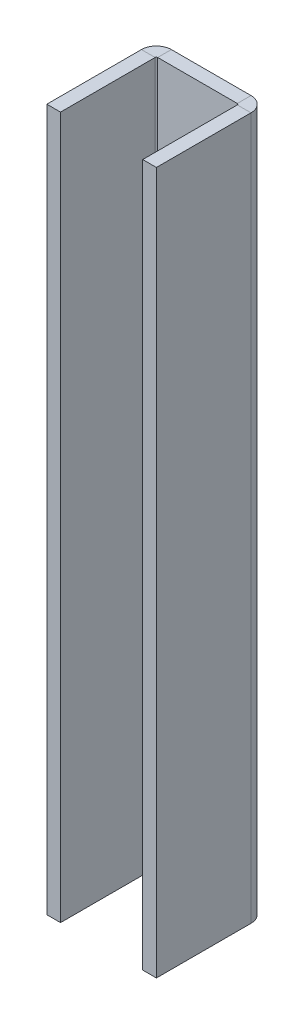
ISO-10303-21;
HEADER;
FILE_DESCRIPTION(('STEP AP214'),'2;1');
FILE_NAME('part.step','',(''),(''),'','','');
FILE_SCHEMA(('AUTOMOTIVE_DESIGN { 1 0 10303 214 1 1 1 1 }'));
ENDSEC;
DATA;
#1=APPLICATION_CONTEXT('core data for automotive mechanical design processes');
#2=APPLICATION_PROTOCOL_DEFINITION('international standard','automotive_design',2000,#1);
#3=PRODUCT_CONTEXT('',#1,'mechanical');
#4=PRODUCT('Part','Part','',(#3));
#5=PRODUCT_RELATED_PRODUCT_CATEGORY('part','',(#4));
#6=PRODUCT_DEFINITION_FORMATION('','',#4);
#7=PRODUCT_DEFINITION_CONTEXT('part definition',#1,'design');
#8=PRODUCT_DEFINITION('design','',#6,#7);
#9=PRODUCT_DEFINITION_SHAPE('','',#8);
#10=(LENGTH_UNIT() NAMED_UNIT(*) SI_UNIT(.MILLI.,.METRE.));
#11=(NAMED_UNIT(*) PLANE_ANGLE_UNIT() SI_UNIT($,.RADIAN.));
#12=(NAMED_UNIT(*) SI_UNIT($,.STERADIAN.) SOLID_ANGLE_UNIT());
#13=UNCERTAINTY_MEASURE_WITH_UNIT(LENGTH_MEASURE(1.E-05),#10,'distance_accuracy_value','');
#14=(GEOMETRIC_REPRESENTATION_CONTEXT(3) GLOBAL_UNCERTAINTY_ASSIGNED_CONTEXT((#13)) GLOBAL_UNIT_ASSIGNED_CONTEXT((#10,
#11,#12)) REPRESENTATION_CONTEXT('',''));
#15=CARTESIAN_POINT('',(0.,0.,0.));
#16=DIRECTION('',(0.,0.,1.));
#17=DIRECTION('',(1.,0.,0.));
#18=AXIS2_PLACEMENT_3D('',#15,#16,#17);
#19=CARTESIAN_POINT('',(0.,0.,-4.));
#20=DIRECTION('',(0.,0.,-1.));
#21=DIRECTION('',(-1.,0.,0.));
#22=AXIS2_PLACEMENT_3D('',#19,#20,#21);
#23=PLANE('',#22);
#24=DIRECTION('',(-1.,0.,0.));
#25=VECTOR('',#24,1.);
#26=CARTESIAN_POINT('',(8.,410.,-4.));
#27=LINE('',#26,#25);
#28=CARTESIAN_POINT('',(63.2634,410.,-4.));
#29=VERTEX_POINT('',#28);
#30=CARTESIAN_POINT('',(16.7366,410.,-4.));
#31=VERTEX_POINT('',#30);
#32=EDGE_CURVE('E13',#29,#31,#27,.T.);
#33=ORIENTED_EDGE('',*,*,#32,.F.);
#34=DIRECTION('',(0.,1.,0.));
#35=VECTOR('',#34,1.);
#36=CARTESIAN_POINT('',(63.2634,410.,-4.));
#37=LINE('',#36,#35);
#38=CARTESIAN_POINT('',(63.2634,2.77908306346521E-13,-4.));
#39=VERTEX_POINT('',#38);
#40=EDGE_CURVE('E178',#29,#39,#37,.F.);
#41=ORIENTED_EDGE('',*,*,#40,.T.);
#42=DIRECTION('',(1.,0.,0.));
#43=VECTOR('',#42,1.);
#44=CARTESIAN_POINT('',(8.,0.,-4.));
#45=LINE('',#44,#43);
#46=CARTESIAN_POINT('',(16.7366,0.,-4.));
#47=VERTEX_POINT('',#46);
#48=EDGE_CURVE('E92',#47,#39,#45,.T.);
#49=ORIENTED_EDGE('',*,*,#48,.F.);
#50=DIRECTION('',(0.,-1.,0.));
#51=VECTOR('',#50,1.);
#52=CARTESIAN_POINT('',(16.7366,0.,-4.));
#53=LINE('',#52,#51);
#54=EDGE_CURVE('E264',#47,#31,#53,.F.);
#55=ORIENTED_EDGE('',*,*,#54,.T.);
#56=EDGE_LOOP('',(#33,#41,#49,#55));
#57=FACE_BOUND('',#56,.T.);
#58=ADVANCED_FACE('F83',(#57),#23,.T.);
#59=CARTESIAN_POINT('',(0.,0.,4.));
#60=DIRECTION('',(0.,0.,-1.));
#61=DIRECTION('',(-1.,0.,0.));
#62=AXIS2_PLACEMENT_3D('',#59,#60,#61);
#63=PLANE('',#62);
#64=DIRECTION('',(0.,1.,0.));
#65=VECTOR('',#64,1.);
#66=CARTESIAN_POINT('',(63.2634,410.,4.));
#67=LINE('',#66,#65);
#68=CARTESIAN_POINT('',(63.2634,410.,4.));
#69=VERTEX_POINT('',#68);
#70=CARTESIAN_POINT('',(63.2634,2.22044604925031E-13,4.));
#71=VERTEX_POINT('',#70);
#72=EDGE_CURVE('E227',#69,#71,#67,.F.);
#73=ORIENTED_EDGE('',*,*,#72,.F.);
#74=DIRECTION('',(-1.,0.,0.));
#75=VECTOR('',#74,1.);
#76=CARTESIAN_POINT('',(8.,410.,4.));
#77=LINE('',#76,#75);
#78=CARTESIAN_POINT('',(16.7366,410.,4.));
#79=VERTEX_POINT('',#78);
#80=EDGE_CURVE('E87',#69,#79,#77,.T.);
#81=ORIENTED_EDGE('',*,*,#80,.T.);
#82=DIRECTION('',(0.,-1.,0.));
#83=VECTOR('',#82,1.);
#84=CARTESIAN_POINT('',(16.7366,0.,4.));
#85=LINE('',#84,#83);
#86=CARTESIAN_POINT('',(16.7366,0.,4.));
#87=VERTEX_POINT('',#86);
#88=EDGE_CURVE('E275',#87,#79,#85,.F.);
#89=ORIENTED_EDGE('',*,*,#88,.F.);
#90=DIRECTION('',(1.,0.,0.));
#91=VECTOR('',#90,1.);
#92=CARTESIAN_POINT('',(8.,0.,4.));
#93=LINE('',#92,#91);
#94=EDGE_CURVE('E281',#87,#71,#93,.T.);
#95=ORIENTED_EDGE('',*,*,#94,.T.);
#96=EDGE_LOOP('',(#73,#81,#89,#95));
#97=FACE_BOUND('',#96,.T.);
#98=ADVANCED_FACE('F293',(#97),#63,.F.);
#99=CARTESIAN_POINT('',(8.,410.,-4.));
#100=DIRECTION('',(0.,1.,0.));
#101=DIRECTION('',(0.,0.,1.));
#102=AXIS2_PLACEMENT_3D('',#99,#100,#101);
#103=PLANE('',#102);
#104=ORIENTED_EDGE('',*,*,#80,.F.);
#105=DIRECTION('',(0.,0.,-1.));
#106=VECTOR('',#105,1.);
#107=CARTESIAN_POINT('',(63.2634,410.,4.));
#108=LINE('',#107,#106);
#109=EDGE_CURVE('E223',#69,#29,#108,.T.);
#110=ORIENTED_EDGE('',*,*,#109,.T.);
#111=ORIENTED_EDGE('',*,*,#32,.T.);
#112=DIRECTION('',(0.,0.,-1.));
#113=VECTOR('',#112,1.);
#114=CARTESIAN_POINT('',(16.7366,410.,4.));
#115=LINE('',#114,#113);
#116=EDGE_CURVE('E279',#79,#31,#115,.T.);
#117=ORIENTED_EDGE('',*,*,#116,.F.);
#118=EDGE_LOOP('',(#104,#110,#111,#117));
#119=FACE_BOUND('',#118,.T.);
#120=ADVANCED_FACE('F295',(#119),#103,.T.);
#121=CARTESIAN_POINT('',(8.,0.,-4.));
#122=DIRECTION('',(0.,-1.,0.));
#123=DIRECTION('',(1.,0.,0.));
#124=AXIS2_PLACEMENT_3D('',#121,#122,#123);
#125=PLANE('',#124);
#126=DIRECTION('',(0.,0.,-1.));
#127=VECTOR('',#126,1.);
#128=CARTESIAN_POINT('',(63.2634,2.22044604925031E-13,4.));
#129=LINE('',#128,#127);
#130=EDGE_CURVE('E230',#71,#39,#129,.T.);
#131=ORIENTED_EDGE('',*,*,#130,.F.);
#132=ORIENTED_EDGE('',*,*,#94,.F.);
#133=DIRECTION('',(0.,0.,-1.));
#134=VECTOR('',#133,1.);
#135=CARTESIAN_POINT('',(16.7366,0.,4.));
#136=LINE('',#135,#134);
#137=EDGE_CURVE('E269',#87,#47,#136,.T.);
#138=ORIENTED_EDGE('',*,*,#137,.T.);
#139=ORIENTED_EDGE('',*,*,#48,.T.);
#140=EDGE_LOOP('',(#131,#132,#138,#139));
#141=FACE_BOUND('',#140,.T.);
#142=ADVANCED_FACE('F85',(#141),#125,.T.);
#143=CARTESIAN_POINT('',(16.7366,410.,4.7366));
#144=DIRECTION('',(0.,1.,0.));
#145=DIRECTION('',(0.,0.,1.));
#146=AXIS2_PLACEMENT_3D('',#143,#144,#145);
#147=PLANE('',#146);
#148=DIRECTION('',(1.,0.,0.));
#149=VECTOR('',#148,1.);
#150=CARTESIAN_POINT('',(8.,410.,4.73659999999997));
#151=LINE('',#150,#149);
#152=CARTESIAN_POINT('',(16.,410.,4.7366));
#153=VERTEX_POINT('',#152);
#154=CARTESIAN_POINT('',(8.,410.,4.73659999999997));
#155=VERTEX_POINT('',#154);
#156=EDGE_CURVE('E232',#153,#155,#151,.F.);
#157=ORIENTED_EDGE('',*,*,#156,.F.);
#158=CARTESIAN_POINT('',(16.7366,410.,4.7366));
#159=DIRECTION('',(0.,-1.,0.));
#160=DIRECTION('',(0.,0.,-1.));
#161=AXIS2_PLACEMENT_3D('',#158,#159,#160);
#162=CIRCLE('',#161,0.7366);
#163=EDGE_CURVE('E272',#79,#153,#162,.F.);
#164=ORIENTED_EDGE('',*,*,#163,.F.);
#165=ORIENTED_EDGE('',*,*,#116,.T.);
#166=CARTESIAN_POINT('',(16.7366,410.,4.7366));
#167=DIRECTION('',(0.,-1.,0.));
#168=DIRECTION('',(0.,0.,-1.));
#169=AXIS2_PLACEMENT_3D('',#166,#167,#168);
#170=CIRCLE('',#169,8.7366);
#171=EDGE_CURVE('E100',#31,#155,#170,.F.);
#172=ORIENTED_EDGE('',*,*,#171,.T.);
#173=EDGE_LOOP('',(#157,#164,#165,#172));
#174=FACE_BOUND('',#173,.T.);
#175=ADVANCED_FACE('F299',(#174),#147,.T.);
#176=CARTESIAN_POINT('',(16.7366,0.,4.7366));
#177=DIRECTION('',(0.,1.,0.));
#178=DIRECTION('',(0.,0.,1.));
#179=AXIS2_PLACEMENT_3D('',#176,#177,#178);
#180=PLANE('',#179);
#181=CARTESIAN_POINT('',(16.7366,0.,4.7366));
#182=DIRECTION('',(0.,-1.,0.));
#183=DIRECTION('',(0.,0.,-1.));
#184=AXIS2_PLACEMENT_3D('',#181,#182,#183);
#185=CIRCLE('',#184,0.7366);
#186=CARTESIAN_POINT('',(16.,0.,4.7366));
#187=VERTEX_POINT('',#186);
#188=EDGE_CURVE('E237',#187,#87,#185,.T.);
#189=ORIENTED_EDGE('',*,*,#188,.F.);
#190=DIRECTION('',(1.,0.,0.));
#191=VECTOR('',#190,1.);
#192=CARTESIAN_POINT('',(16.,0.,4.7366));
#193=LINE('',#192,#191);
#194=CARTESIAN_POINT('',(8.,0.,4.73659999999997));
#195=VERTEX_POINT('',#194);
#196=EDGE_CURVE('E257',#187,#195,#193,.F.);
#197=ORIENTED_EDGE('',*,*,#196,.T.);
#198=CARTESIAN_POINT('',(16.7366,0.,4.7366));
#199=DIRECTION('',(0.,-1.,0.));
#200=DIRECTION('',(0.,0.,-1.));
#201=AXIS2_PLACEMENT_3D('',#198,#199,#200);
#202=CIRCLE('',#201,8.7366);
#203=EDGE_CURVE('E267',#195,#47,#202,.T.);
#204=ORIENTED_EDGE('',*,*,#203,.T.);
#205=ORIENTED_EDGE('',*,*,#137,.F.);
#206=EDGE_LOOP('',(#189,#197,#204,#205));
#207=FACE_BOUND('',#206,.T.);
#208=ADVANCED_FACE('F323',(#207),#180,.F.);
#209=CARTESIAN_POINT('',(16.7366,0.,4.7366));
#210=DIRECTION('',(0.,-1.,0.));
#211=DIRECTION('',(-1.,0.,0.));
#212=AXIS2_PLACEMENT_3D('',#209,#210,#211);
#213=CYLINDRICAL_SURFACE('',#212,8.7366);
#214=ORIENTED_EDGE('',*,*,#54,.F.);
#215=ORIENTED_EDGE('',*,*,#203,.F.);
#216=DIRECTION('',(0.,-1.,0.));
#217=VECTOR('',#216,1.);
#218=CARTESIAN_POINT('',(8.,410.,4.73659999999997));
#219=LINE('',#218,#217);
#220=EDGE_CURVE('E255',#195,#155,#219,.F.);
#221=ORIENTED_EDGE('',*,*,#220,.T.);
#222=ORIENTED_EDGE('',*,*,#171,.F.);
#223=EDGE_LOOP('',(#214,#215,#221,#222));
#224=FACE_BOUND('',#223,.T.);
#225=ADVANCED_FACE('F326',(#224),#213,.T.);
#226=CARTESIAN_POINT('',(16.7366,0.,4.7366));
#227=DIRECTION('',(0.,-1.,0.));
#228=DIRECTION('',(-1.,0.,0.));
#229=AXIS2_PLACEMENT_3D('',#226,#227,#228);
#230=CYLINDRICAL_SURFACE('',#229,0.7366);
#231=ORIENTED_EDGE('',*,*,#88,.T.);
#232=ORIENTED_EDGE('',*,*,#163,.T.);
#233=DIRECTION('',(0.,-1.,0.));
#234=VECTOR('',#233,1.);
#235=CARTESIAN_POINT('',(16.,410.,4.7366));
#236=LINE('',#235,#234);
#237=EDGE_CURVE('E260',#153,#187,#236,.T.);
#238=ORIENTED_EDGE('',*,*,#237,.T.);
#239=ORIENTED_EDGE('',*,*,#188,.T.);
#240=EDGE_LOOP('',(#231,#232,#238,#239));
#241=FACE_BOUND('',#240,.T.);
#242=ADVANCED_FACE('F302',(#241),#230,.F.);
#243=CARTESIAN_POINT('',(7.9999999999998,0.,60.));
#244=DIRECTION('',(0.,1.,0.));
#245=DIRECTION('',(0.,0.,1.));
#246=AXIS2_PLACEMENT_3D('',#243,#244,#245);
#247=PLANE('',#246);
#248=ORIENTED_EDGE('',*,*,#196,.F.);
#249=DIRECTION('',(0.,0.,-1.));
#250=VECTOR('',#249,1.);
#251=CARTESIAN_POINT('',(15.9999999999998,0.,60.));
#252=LINE('',#251,#250);
#253=CARTESIAN_POINT('',(15.9999999999998,0.,60.));
#254=VERTEX_POINT('',#253);
#255=EDGE_CURVE('E253',#187,#254,#252,.F.);
#256=ORIENTED_EDGE('',*,*,#255,.T.);
#257=DIRECTION('',(1.,0.,0.));
#258=VECTOR('',#257,1.);
#259=CARTESIAN_POINT('',(7.9999999999998,0.,60.));
#260=LINE('',#259,#258);
#261=CARTESIAN_POINT('',(7.9999999999998,0.,60.));
#262=VERTEX_POINT('',#261);
#263=EDGE_CURVE('E234',#262,#254,#260,.T.);
#264=ORIENTED_EDGE('',*,*,#263,.F.);
#265=DIRECTION('',(0.,0.,1.));
#266=VECTOR('',#265,1.);
#267=CARTESIAN_POINT('',(8.00000000000001,0.,0.));
#268=LINE('',#267,#266);
#269=EDGE_CURVE('E246',#195,#262,#268,.T.);
#270=ORIENTED_EDGE('',*,*,#269,.F.);
#271=EDGE_LOOP('',(#248,#256,#264,#270));
#272=FACE_BOUND('',#271,.T.);
#273=ADVANCED_FACE('F320',(#272),#247,.F.);
#274=CARTESIAN_POINT('',(8.,410.,3.99999999999997));
#275=DIRECTION('',(0.,-1.,0.));
#276=DIRECTION('',(0.,0.,-1.));
#277=AXIS2_PLACEMENT_3D('',#274,#275,#276);
#278=PLANE('',#277);
#279=ORIENTED_EDGE('',*,*,#156,.T.);
#280=DIRECTION('',(0.,0.,-1.));
#281=VECTOR('',#280,1.);
#282=CARTESIAN_POINT('',(8.00000000000001,410.,0.));
#283=LINE('',#282,#281);
#284=CARTESIAN_POINT('',(7.9999999999998,410.,60.));
#285=VERTEX_POINT('',#284);
#286=EDGE_CURVE('E241',#285,#155,#283,.T.);
#287=ORIENTED_EDGE('',*,*,#286,.F.);
#288=DIRECTION('',(1.,0.,0.));
#289=VECTOR('',#288,1.);
#290=CARTESIAN_POINT('',(7.9999999999998,410.,60.));
#291=LINE('',#290,#289);
#292=CARTESIAN_POINT('',(15.9999999999998,410.,60.));
#293=VERTEX_POINT('',#292);
#294=EDGE_CURVE('E238',#285,#293,#291,.T.);
#295=ORIENTED_EDGE('',*,*,#294,.T.);
#296=DIRECTION('',(0.,0.,1.));
#297=VECTOR('',#296,1.);
#298=CARTESIAN_POINT('',(16.,410.,4.));
#299=LINE('',#298,#297);
#300=EDGE_CURVE('E248',#293,#153,#299,.F.);
#301=ORIENTED_EDGE('',*,*,#300,.T.);
#302=EDGE_LOOP('',(#279,#287,#295,#301));
#303=FACE_BOUND('',#302,.T.);
#304=ADVANCED_FACE('F310',(#303),#278,.F.);
#305=CARTESIAN_POINT('',(8.00000000000001,0.,0.));
#306=DIRECTION('',(1.,0.,0.));
#307=DIRECTION('',(0.,0.,-1.));
#308=AXIS2_PLACEMENT_3D('',#305,#306,#307);
#309=PLANE('',#308);
#310=ORIENTED_EDGE('',*,*,#220,.F.);
#311=ORIENTED_EDGE('',*,*,#269,.T.);
#312=DIRECTION('',(0.,1.,0.));
#313=VECTOR('',#312,1.);
#314=CARTESIAN_POINT('',(7.9999999999998,0.,60.));
#315=LINE('',#314,#313);
#316=EDGE_CURVE('E244',#262,#285,#315,.T.);
#317=ORIENTED_EDGE('',*,*,#316,.T.);
#318=ORIENTED_EDGE('',*,*,#286,.T.);
#319=EDGE_LOOP('',(#310,#311,#317,#318));
#320=FACE_BOUND('',#319,.T.);
#321=ADVANCED_FACE('F325',(#320),#309,.F.);
#322=CARTESIAN_POINT('',(16.,0.,0.));
#323=DIRECTION('',(1.,0.,0.));
#324=DIRECTION('',(0.,0.,-1.));
#325=AXIS2_PLACEMENT_3D('',#322,#323,#324);
#326=PLANE('',#325);
#327=ORIENTED_EDGE('',*,*,#255,.F.);
#328=ORIENTED_EDGE('',*,*,#237,.F.);
#329=ORIENTED_EDGE('',*,*,#300,.F.);
#330=DIRECTION('',(0.,-1.,0.));
#331=VECTOR('',#330,1.);
#332=CARTESIAN_POINT('',(15.9999999999998,410.,60.));
#333=LINE('',#332,#331);
#334=EDGE_CURVE('E251',#254,#293,#333,.F.);
#335=ORIENTED_EDGE('',*,*,#334,.F.);
#336=EDGE_LOOP('',(#327,#328,#329,#335));
#337=FACE_BOUND('',#336,.T.);
#338=ADVANCED_FACE('F307',(#337),#326,.T.);
#339=CARTESIAN_POINT('',(7.9999999999998,410.,60.));
#340=DIRECTION('',(0.,0.,-1.));
#341=DIRECTION('',(-1.,0.,0.));
#342=AXIS2_PLACEMENT_3D('',#339,#340,#341);
#343=PLANE('',#342);
#344=ORIENTED_EDGE('',*,*,#334,.T.);
#345=ORIENTED_EDGE('',*,*,#294,.F.);
#346=ORIENTED_EDGE('',*,*,#316,.F.);
#347=ORIENTED_EDGE('',*,*,#263,.T.);
#348=EDGE_LOOP('',(#344,#345,#346,#347));
#349=FACE_BOUND('',#348,.T.);
#350=ADVANCED_FACE('F315',(#349),#343,.F.);
#351=CARTESIAN_POINT('',(63.2634,2.22044604925031E-13,4.7366));
#352=DIRECTION('',(0.,-1.,0.));
#353=DIRECTION('',(0.,0.,-1.));
#354=AXIS2_PLACEMENT_3D('',#351,#352,#353);
#355=PLANE('',#354);
#356=DIRECTION('',(-1.,0.,0.));
#357=VECTOR('',#356,1.);
#358=CARTESIAN_POINT('',(72.,2.20584265139426E-13,4.73659999999998));
#359=LINE('',#358,#357);
#360=CARTESIAN_POINT('',(64.,2.22044604925031E-13,4.7366));
#361=VERTEX_POINT('',#360);
#362=CARTESIAN_POINT('',(72.,2.22044604925031E-13,4.73659999999997));
#363=VERTEX_POINT('',#362);
#364=EDGE_CURVE('E219',#361,#363,#359,.F.);
#365=ORIENTED_EDGE('',*,*,#364,.F.);
#366=CARTESIAN_POINT('',(63.2634,2.22044604925031E-13,4.7366));
#367=DIRECTION('',(0.,1.,0.));
#368=DIRECTION('',(0.,0.,1.));
#369=AXIS2_PLACEMENT_3D('',#366,#367,#368);
#370=CIRCLE('',#369,0.736600000000004);
#371=EDGE_CURVE('E181',#71,#361,#370,.F.);
#372=ORIENTED_EDGE('',*,*,#371,.F.);
#373=ORIENTED_EDGE('',*,*,#130,.T.);
#374=CARTESIAN_POINT('',(63.2634,2.22044604925031E-13,4.7366));
#375=DIRECTION('',(0.,1.,0.));
#376=DIRECTION('',(0.,0.,1.));
#377=AXIS2_PLACEMENT_3D('',#374,#375,#376);
#378=CIRCLE('',#377,8.7366);
#379=EDGE_CURVE('E108',#39,#363,#378,.F.);
#380=ORIENTED_EDGE('',*,*,#379,.T.);
#381=EDGE_LOOP('',(#365,#372,#373,#380));
#382=FACE_BOUND('',#381,.T.);
#383=ADVANCED_FACE('F333',(#382),#355,.T.);
#384=CARTESIAN_POINT('',(63.2634,410.,4.7366));
#385=DIRECTION('',(0.,-1.,0.));
#386=DIRECTION('',(0.,0.,-1.));
#387=AXIS2_PLACEMENT_3D('',#384,#385,#386);
#388=PLANE('',#387);
#389=CARTESIAN_POINT('',(63.2634,410.,4.7366));
#390=DIRECTION('',(0.,1.,0.));
#391=DIRECTION('',(0.,0.,1.));
#392=AXIS2_PLACEMENT_3D('',#389,#390,#391);
#393=CIRCLE('',#392,0.736600000000004);
#394=CARTESIAN_POINT('',(64.,410.,4.7366));
#395=VERTEX_POINT('',#394);
#396=EDGE_CURVE('E188',#395,#69,#393,.T.);
#397=ORIENTED_EDGE('',*,*,#396,.F.);
#398=DIRECTION('',(-1.,0.,0.));
#399=VECTOR('',#398,1.);
#400=CARTESIAN_POINT('',(64.,410.,4.73659999999999));
#401=LINE('',#400,#399);
#402=CARTESIAN_POINT('',(72.,410.,4.73659999999997));
#403=VERTEX_POINT('',#402);
#404=EDGE_CURVE('E185',#395,#403,#401,.F.);
#405=ORIENTED_EDGE('',*,*,#404,.T.);
#406=CARTESIAN_POINT('',(63.2634,410.,4.7366));
#407=DIRECTION('',(0.,1.,0.));
#408=DIRECTION('',(0.,0.,1.));
#409=AXIS2_PLACEMENT_3D('',#406,#407,#408);
#410=CIRCLE('',#409,8.7366);
#411=EDGE_CURVE('E172',#403,#29,#410,.T.);
#412=ORIENTED_EDGE('',*,*,#411,.T.);
#413=ORIENTED_EDGE('',*,*,#109,.F.);
#414=EDGE_LOOP('',(#397,#405,#412,#413));
#415=FACE_BOUND('',#414,.T.);
#416=ADVANCED_FACE('F186',(#415),#388,.F.);
#417=CARTESIAN_POINT('',(63.2634,410.,4.7366));
#418=DIRECTION('',(0.,1.,0.));
#419=DIRECTION('',(1.,0.,0.));
#420=AXIS2_PLACEMENT_3D('',#417,#418,#419);
#421=CYLINDRICAL_SURFACE('',#420,8.7366);
#422=ORIENTED_EDGE('',*,*,#40,.F.);
#423=ORIENTED_EDGE('',*,*,#411,.F.);
#424=DIRECTION('',(0.,1.,0.));
#425=VECTOR('',#424,1.);
#426=CARTESIAN_POINT('',(72.,0.,4.73659999999998));
#427=LINE('',#426,#425);
#428=EDGE_CURVE('E176',#363,#403,#427,.T.);
#429=ORIENTED_EDGE('',*,*,#428,.F.);
#430=ORIENTED_EDGE('',*,*,#379,.F.);
#431=EDGE_LOOP('',(#422,#423,#429,#430));
#432=FACE_BOUND('',#431,.T.);
#433=ADVANCED_FACE('F174',(#432),#421,.T.);
#434=CARTESIAN_POINT('',(63.2634,410.,4.7366));
#435=DIRECTION('',(0.,1.,0.));
#436=DIRECTION('',(1.,0.,0.));
#437=AXIS2_PLACEMENT_3D('',#434,#435,#436);
#438=CYLINDRICAL_SURFACE('',#437,0.736600000000004);
#439=ORIENTED_EDGE('',*,*,#72,.T.);
#440=ORIENTED_EDGE('',*,*,#371,.T.);
#441=DIRECTION('',(0.,-1.,0.));
#442=VECTOR('',#441,1.);
#443=CARTESIAN_POINT('',(64.,1.665330301773E-13,4.73660000000001));
#444=LINE('',#443,#442);
#445=EDGE_CURVE('E192',#361,#395,#444,.F.);
#446=ORIENTED_EDGE('',*,*,#445,.T.);
#447=ORIENTED_EDGE('',*,*,#396,.T.);
#448=EDGE_LOOP('',(#439,#440,#446,#447));
#449=FACE_BOUND('',#448,.T.);
#450=ADVANCED_FACE('F336',(#449),#438,.F.);
#451=CARTESIAN_POINT('',(72.,410.,3.99999999999997));
#452=DIRECTION('',(0.,-1.,0.));
#453=DIRECTION('',(0.,0.,-1.));
#454=AXIS2_PLACEMENT_3D('',#451,#452,#453);
#455=PLANE('',#454);
#456=ORIENTED_EDGE('',*,*,#404,.F.);
#457=DIRECTION('',(0.,0.,1.));
#458=VECTOR('',#457,1.);
#459=CARTESIAN_POINT('',(64.,410.,4.));
#460=LINE('',#459,#458);
#461=CARTESIAN_POINT('',(64.0000000000002,410.,60.));
#462=VERTEX_POINT('',#461);
#463=EDGE_CURVE('E201',#395,#462,#460,.T.);
#464=ORIENTED_EDGE('',*,*,#463,.T.);
#465=DIRECTION('',(-1.,0.,0.));
#466=VECTOR('',#465,1.);
#467=CARTESIAN_POINT('',(72.0000000000002,410.,60.));
#468=LINE('',#467,#466);
#469=CARTESIAN_POINT('',(72.0000000000002,410.,60.));
#470=VERTEX_POINT('',#469);
#471=EDGE_CURVE('E205',#470,#462,#468,.T.);
#472=ORIENTED_EDGE('',*,*,#471,.F.);
#473=DIRECTION('',(0.,0.,-1.));
#474=VECTOR('',#473,1.);
#475=CARTESIAN_POINT('',(72.,410.,5.35109826063441E-13));
#476=LINE('',#475,#474);
#477=EDGE_CURVE('E197',#403,#470,#476,.F.);
#478=ORIENTED_EDGE('',*,*,#477,.F.);
#479=EDGE_LOOP('',(#456,#464,#472,#478));
#480=FACE_BOUND('',#479,.T.);
#481=ADVANCED_FACE('F203',(#480),#455,.F.);
#482=CARTESIAN_POINT('',(72.0000000000002,1.11022302462516E-13,60.));
#483=DIRECTION('',(0.,1.,0.));
#484=DIRECTION('',(0.,0.,1.));
#485=AXIS2_PLACEMENT_3D('',#482,#483,#484);
#486=PLANE('',#485);
#487=ORIENTED_EDGE('',*,*,#364,.T.);
#488=DIRECTION('',(0.,0.,1.));
#489=VECTOR('',#488,1.);
#490=CARTESIAN_POINT('',(72.,2.2997476938664E-13,-2.77732031251405E-13));
#491=LINE('',#490,#489);
#492=CARTESIAN_POINT('',(72.0000000000002,1.11022302462516E-13,60.));
#493=VERTEX_POINT('',#492);
#494=EDGE_CURVE('E200',#493,#363,#491,.F.);
#495=ORIENTED_EDGE('',*,*,#494,.F.);
#496=DIRECTION('',(-1.,0.,0.));
#497=VECTOR('',#496,1.);
#498=CARTESIAN_POINT('',(72.0000000000002,1.11022302462516E-13,60.));
#499=LINE('',#498,#497);
#500=CARTESIAN_POINT('',(64.0000000000002,1.11022302462516E-13,60.));
#501=VERTEX_POINT('',#500);
#502=EDGE_CURVE('E345',#493,#501,#499,.T.);
#503=ORIENTED_EDGE('',*,*,#502,.T.);
#504=DIRECTION('',(0.,0.,-1.));
#505=VECTOR('',#504,1.);
#506=CARTESIAN_POINT('',(64.0000000000002,1.11022302462516E-13,60.));
#507=LINE('',#506,#505);
#508=EDGE_CURVE('E208',#501,#361,#507,.T.);
#509=ORIENTED_EDGE('',*,*,#508,.T.);
#510=EDGE_LOOP('',(#487,#495,#503,#509));
#511=FACE_BOUND('',#510,.T.);
#512=ADVANCED_FACE('F343',(#511),#486,.F.);
#513=CARTESIAN_POINT('',(72.,0.,-2.77732031251405E-13));
#514=DIRECTION('',(1.,0.,0.));
#515=DIRECTION('',(0.,0.,-1.));
#516=AXIS2_PLACEMENT_3D('',#513,#514,#515);
#517=PLANE('',#516);
#518=ORIENTED_EDGE('',*,*,#494,.T.);
#519=ORIENTED_EDGE('',*,*,#428,.T.);
#520=ORIENTED_EDGE('',*,*,#477,.T.);
#521=DIRECTION('',(0.,1.,0.));
#522=VECTOR('',#521,1.);
#523=CARTESIAN_POINT('',(72.0000000000002,0.,60.));
#524=LINE('',#523,#522);
#525=EDGE_CURVE('E207',#470,#493,#524,.F.);
#526=ORIENTED_EDGE('',*,*,#525,.T.);
#527=EDGE_LOOP('',(#518,#519,#520,#526));
#528=FACE_BOUND('',#527,.T.);
#529=ADVANCED_FACE('F196',(#528),#517,.T.);
#530=CARTESIAN_POINT('',(64.,0.,-2.4980018054066E-13));
#531=DIRECTION('',(1.,0.,0.));
#532=DIRECTION('',(0.,0.,-1.));
#533=AXIS2_PLACEMENT_3D('',#530,#531,#532);
#534=PLANE('',#533);
#535=ORIENTED_EDGE('',*,*,#445,.F.);
#536=ORIENTED_EDGE('',*,*,#508,.F.);
#537=DIRECTION('',(0.,-1.,0.));
#538=VECTOR('',#537,1.);
#539=CARTESIAN_POINT('',(64.0000000000002,410.,60.));
#540=LINE('',#539,#538);
#541=EDGE_CURVE('E212',#462,#501,#540,.T.);
#542=ORIENTED_EDGE('',*,*,#541,.F.);
#543=ORIENTED_EDGE('',*,*,#463,.F.);
#544=EDGE_LOOP('',(#535,#536,#542,#543));
#545=FACE_BOUND('',#544,.T.);
#546=ADVANCED_FACE('F339',(#545),#534,.F.);
#547=CARTESIAN_POINT('',(72.0000000000002,410.,60.));
#548=DIRECTION('',(0.,0.,-1.));
#549=DIRECTION('',(-1.,0.,0.));
#550=AXIS2_PLACEMENT_3D('',#547,#548,#549);
#551=PLANE('',#550);
#552=ORIENTED_EDGE('',*,*,#541,.T.);
#553=ORIENTED_EDGE('',*,*,#502,.F.);
#554=ORIENTED_EDGE('',*,*,#525,.F.);
#555=ORIENTED_EDGE('',*,*,#471,.T.);
#556=EDGE_LOOP('',(#552,#553,#554,#555));
#557=FACE_BOUND('',#556,.T.);
#558=ADVANCED_FACE('F349',(#557),#551,.F.);
#559=CLOSED_SHELL('',(#58,#98,#120,#142,#175,#208,#225,#242,#273,#304,#321,#338,#350,#383,#416,
#433,#450,#481,#512,#529,#546,#558));
#560=MANIFOLD_SOLID_BREP('B2',#559);
#561=ADVANCED_BREP_SHAPE_REPRESENTATION('',(#18,#560),#14);
#562=SHAPE_DEFINITION_REPRESENTATION(#9,#561);
ENDSEC;
END-ISO-10303-21;
